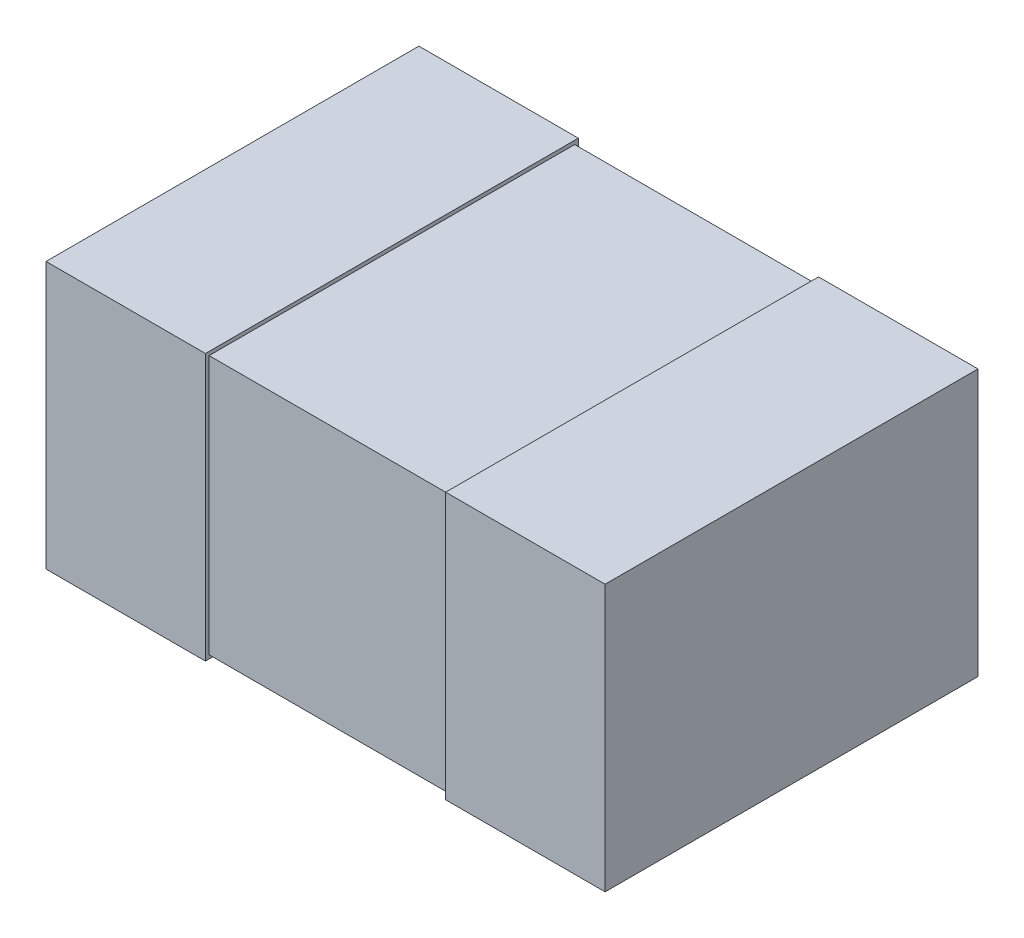
ISO-10303-21;
HEADER;
FILE_DESCRIPTION(('STEP AP214'),'2;1');
FILE_NAME('part.step','',(''),(''),'','','');
FILE_SCHEMA(('AUTOMOTIVE_DESIGN { 1 0 10303 214 1 1 1 1 }'));
ENDSEC;
DATA;
#1=APPLICATION_CONTEXT('core data for automotive mechanical design processes');
#2=APPLICATION_PROTOCOL_DEFINITION('international standard','automotive_design',2000,#1);
#3=PRODUCT_CONTEXT('',#1,'mechanical');
#4=PRODUCT('Part','Part','',(#3));
#5=PRODUCT_RELATED_PRODUCT_CATEGORY('part','',(#4));
#6=PRODUCT_DEFINITION_FORMATION('','',#4);
#7=PRODUCT_DEFINITION_CONTEXT('part definition',#1,'design');
#8=PRODUCT_DEFINITION('design','',#6,#7);
#9=PRODUCT_DEFINITION_SHAPE('','',#8);
#10=(LENGTH_UNIT() NAMED_UNIT(*) SI_UNIT(.MILLI.,.METRE.));
#11=(NAMED_UNIT(*) PLANE_ANGLE_UNIT() SI_UNIT($,.RADIAN.));
#12=(NAMED_UNIT(*) SI_UNIT($,.STERADIAN.) SOLID_ANGLE_UNIT());
#13=UNCERTAINTY_MEASURE_WITH_UNIT(LENGTH_MEASURE(1.E-05),#10,'distance_accuracy_value','');
#14=(GEOMETRIC_REPRESENTATION_CONTEXT(3) GLOBAL_UNCERTAINTY_ASSIGNED_CONTEXT((#13)) GLOBAL_UNIT_ASSIGNED_CONTEXT((#10,
#11,#12)) REPRESENTATION_CONTEXT('',''));
#15=CARTESIAN_POINT('',(0.,0.,0.));
#16=DIRECTION('',(0.,0.,1.));
#17=DIRECTION('',(1.,0.,0.));
#18=AXIS2_PLACEMENT_3D('',#15,#16,#17);
#19=CARTESIAN_POINT('',(-0.229,0.247,0.007));
#20=DIRECTION('',(-1.,0.,0.));
#21=DIRECTION('',(0.,0.,1.));
#22=AXIS2_PLACEMENT_3D('',#19,#20,#21);
#23=PLANE('',#22);
#24=DIRECTION('',(0.,1.,0.));
#25=VECTOR('',#24,1.);
#26=CARTESIAN_POINT('',(-0.229,-0.247,0.704));
#27=LINE('',#26,#25);
#28=CARTESIAN_POINT('',(-0.229,0.247,0.704));
#29=VERTEX_POINT('',#28);
#30=CARTESIAN_POINT('',(-0.229,-0.247,0.704));
#31=VERTEX_POINT('',#30);
#32=EDGE_CURVE('P0_E68',#29,#31,#27,.F.);
#33=ORIENTED_EDGE('',*,*,#32,.F.);
#34=DIRECTION('',(0.,0.,1.));
#35=VECTOR('',#34,1.);
#36=CARTESIAN_POINT('',(-0.229,0.247,0.007));
#37=LINE('',#36,#35);
#38=CARTESIAN_POINT('',(-0.229,0.247,0.007));
#39=VERTEX_POINT('',#38);
#40=EDGE_CURVE('P0_E55',#39,#29,#37,.T.);
#41=ORIENTED_EDGE('',*,*,#40,.F.);
#42=DIRECTION('',(0.,1.,0.));
#43=VECTOR('',#42,1.);
#44=CARTESIAN_POINT('',(-0.229,0.247,0.007));
#45=LINE('',#44,#43);
#46=CARTESIAN_POINT('',(-0.229,-0.247,0.007));
#47=VERTEX_POINT('',#46);
#48=EDGE_CURVE('P0_E20',#47,#39,#45,.T.);
#49=ORIENTED_EDGE('',*,*,#48,.F.);
#50=DIRECTION('',(0.,0.,-1.));
#51=VECTOR('',#50,1.);
#52=CARTESIAN_POINT('',(-0.229,-0.247,0.007));
#53=LINE('',#52,#51);
#54=EDGE_CURVE('P0_E81',#31,#47,#53,.T.);
#55=ORIENTED_EDGE('',*,*,#54,.F.);
#56=EDGE_LOOP('',(#33,#41,#49,#55));
#57=FACE_BOUND('',#56,.T.);
#58=ADVANCED_FACE('P0_F17',(#57),#23,.T.);
#59=CARTESIAN_POINT('',(-0.229,0.247,0.007));
#60=DIRECTION('',(0.,0.,-1.));
#61=DIRECTION('',(-1.,0.,0.));
#62=AXIS2_PLACEMENT_3D('',#59,#60,#61);
#63=PLANE('',#62);
#64=DIRECTION('',(1.,0.,0.));
#65=VECTOR('',#64,1.);
#66=CARTESIAN_POINT('',(-0.229,-0.247,0.007));
#67=LINE('',#66,#65);
#68=CARTESIAN_POINT('',(0.229,-0.247,0.007));
#69=VERTEX_POINT('',#68);
#70=EDGE_CURVE('P0_E64',#47,#69,#67,.T.);
#71=ORIENTED_EDGE('',*,*,#70,.F.);
#72=ORIENTED_EDGE('',*,*,#48,.T.);
#73=DIRECTION('',(1.,0.,0.));
#74=VECTOR('',#73,1.);
#75=CARTESIAN_POINT('',(0.229,0.247,0.007));
#76=LINE('',#75,#74);
#77=CARTESIAN_POINT('',(0.229,0.247,0.007));
#78=VERTEX_POINT('',#77);
#79=EDGE_CURVE('P0_E61',#78,#39,#76,.F.);
#80=ORIENTED_EDGE('',*,*,#79,.F.);
#81=DIRECTION('',(0.,1.,0.));
#82=VECTOR('',#81,1.);
#83=CARTESIAN_POINT('',(0.229,-0.247,0.007));
#84=LINE('',#83,#82);
#85=EDGE_CURVE('P0_E83',#69,#78,#84,.T.);
#86=ORIENTED_EDGE('',*,*,#85,.F.);
#87=EDGE_LOOP('',(#71,#72,#80,#86));
#88=FACE_BOUND('',#87,.T.);
#89=ADVANCED_FACE('P0_F60',(#88),#63,.T.);
#90=CARTESIAN_POINT('',(0.229,0.247,0.007));
#91=DIRECTION('',(0.,1.,0.));
#92=DIRECTION('',(0.,0.,1.));
#93=AXIS2_PLACEMENT_3D('',#90,#91,#92);
#94=PLANE('',#93);
#95=DIRECTION('',(1.,0.,0.));
#96=VECTOR('',#95,1.);
#97=CARTESIAN_POINT('',(-0.229,0.247,0.704));
#98=LINE('',#97,#96);
#99=CARTESIAN_POINT('',(0.229,0.247,0.704));
#100=VERTEX_POINT('',#99);
#101=EDGE_CURVE('P0_E70',#100,#29,#98,.F.);
#102=ORIENTED_EDGE('',*,*,#101,.F.);
#103=DIRECTION('',(0.,0.,-1.));
#104=VECTOR('',#103,1.);
#105=CARTESIAN_POINT('',(0.229,0.247,0.007));
#106=LINE('',#105,#104);
#107=EDGE_CURVE('P0_E74',#78,#100,#106,.F.);
#108=ORIENTED_EDGE('',*,*,#107,.F.);
#109=ORIENTED_EDGE('',*,*,#79,.T.);
#110=ORIENTED_EDGE('',*,*,#40,.T.);
#111=EDGE_LOOP('',(#102,#108,#109,#110));
#112=FACE_BOUND('',#111,.T.);
#113=ADVANCED_FACE('P0_F72',(#112),#94,.T.);
#114=CARTESIAN_POINT('',(-0.229,-0.247,0.704));
#115=DIRECTION('',(0.,0.,1.));
#116=DIRECTION('',(1.,0.,0.));
#117=AXIS2_PLACEMENT_3D('',#114,#115,#116);
#118=PLANE('',#117);
#119=ORIENTED_EDGE('',*,*,#101,.T.);
#120=ORIENTED_EDGE('',*,*,#32,.T.);
#121=DIRECTION('',(1.,0.,0.));
#122=VECTOR('',#121,1.);
#123=CARTESIAN_POINT('',(-0.229,-0.247,0.704));
#124=LINE('',#123,#122);
#125=CARTESIAN_POINT('',(0.229,-0.247,0.704));
#126=VERTEX_POINT('',#125);
#127=EDGE_CURVE('P0_E35',#126,#31,#124,.F.);
#128=ORIENTED_EDGE('',*,*,#127,.F.);
#129=DIRECTION('',(0.,1.,0.));
#130=VECTOR('',#129,1.);
#131=CARTESIAN_POINT('',(0.229,-0.247,0.704));
#132=LINE('',#131,#130);
#133=EDGE_CURVE('P0_E26',#100,#126,#132,.F.);
#134=ORIENTED_EDGE('',*,*,#133,.F.);
#135=EDGE_LOOP('',(#119,#120,#128,#134));
#136=FACE_BOUND('',#135,.T.);
#137=ADVANCED_FACE('P0_F89',(#136),#118,.T.);
#138=CARTESIAN_POINT('',(-0.229,-0.247,0.007));
#139=DIRECTION('',(0.,-1.,0.));
#140=DIRECTION('',(0.,0.,-1.));
#141=AXIS2_PLACEMENT_3D('',#138,#139,#140);
#142=PLANE('',#141);
#143=ORIENTED_EDGE('',*,*,#127,.T.);
#144=ORIENTED_EDGE('',*,*,#54,.T.);
#145=ORIENTED_EDGE('',*,*,#70,.T.);
#146=DIRECTION('',(0.,0.,-1.));
#147=VECTOR('',#146,1.);
#148=CARTESIAN_POINT('',(0.229,-0.247,0.007));
#149=LINE('',#148,#147);
#150=EDGE_CURVE('P0_E11',#126,#69,#149,.T.);
#151=ORIENTED_EDGE('',*,*,#150,.F.);
#152=EDGE_LOOP('',(#143,#144,#145,#151));
#153=FACE_BOUND('',#152,.T.);
#154=ADVANCED_FACE('P0_F91',(#153),#142,.T.);
#155=CARTESIAN_POINT('',(0.229,-0.247,0.007));
#156=DIRECTION('',(1.,0.,0.));
#157=DIRECTION('',(0.,0.,-1.));
#158=AXIS2_PLACEMENT_3D('',#155,#156,#157);
#159=PLANE('',#158);
#160=ORIENTED_EDGE('',*,*,#133,.T.);
#161=ORIENTED_EDGE('',*,*,#150,.T.);
#162=ORIENTED_EDGE('',*,*,#85,.T.);
#163=ORIENTED_EDGE('',*,*,#107,.T.);
#164=EDGE_LOOP('',(#160,#161,#162,#163));
#165=FACE_BOUND('',#164,.T.);
#166=ADVANCED_FACE('P0_F88',(#165),#159,.T.);
#167=CLOSED_SHELL('',(#58,#89,#113,#137,#154,#166));
#168=MANIFOLD_SOLID_BREP('P0_B1',#167);
#169=CARTESIAN_POINT('',(0.229,0.254,0.));
#170=DIRECTION('',(-1.,0.,0.));
#171=DIRECTION('',(0.,0.,1.));
#172=AXIS2_PLACEMENT_3D('',#169,#170,#171);
#173=PLANE('',#172);
#174=DIRECTION('',(0.,1.,0.));
#175=VECTOR('',#174,1.);
#176=CARTESIAN_POINT('',(0.229,-0.254,0.711));
#177=LINE('',#176,#175);
#178=CARTESIAN_POINT('',(0.229,0.254,0.711));
#179=VERTEX_POINT('',#178);
#180=CARTESIAN_POINT('',(0.229,-0.254,0.711));
#181=VERTEX_POINT('',#180);
#182=EDGE_CURVE('P1_E68',#179,#181,#177,.F.);
#183=ORIENTED_EDGE('',*,*,#182,.F.);
#184=DIRECTION('',(0.,0.,1.));
#185=VECTOR('',#184,1.);
#186=CARTESIAN_POINT('',(0.229,0.254,0.));
#187=LINE('',#186,#185);
#188=CARTESIAN_POINT('',(0.229,0.254,0.));
#189=VERTEX_POINT('',#188);
#190=EDGE_CURVE('P1_E55',#189,#179,#187,.T.);
#191=ORIENTED_EDGE('',*,*,#190,.F.);
#192=DIRECTION('',(0.,1.,0.));
#193=VECTOR('',#192,1.);
#194=CARTESIAN_POINT('',(0.229,0.254,0.));
#195=LINE('',#194,#193);
#196=CARTESIAN_POINT('',(0.229,-0.254,0.));
#197=VERTEX_POINT('',#196);
#198=EDGE_CURVE('P1_E20',#197,#189,#195,.T.);
#199=ORIENTED_EDGE('',*,*,#198,.F.);
#200=DIRECTION('',(0.,0.,-1.));
#201=VECTOR('',#200,1.);
#202=CARTESIAN_POINT('',(0.229,-0.254,0.));
#203=LINE('',#202,#201);
#204=EDGE_CURVE('P1_E81',#181,#197,#203,.T.);
#205=ORIENTED_EDGE('',*,*,#204,.F.);
#206=EDGE_LOOP('',(#183,#191,#199,#205));
#207=FACE_BOUND('',#206,.T.);
#208=ADVANCED_FACE('P1_F17',(#207),#173,.T.);
#209=CARTESIAN_POINT('',(0.229,0.254,0.));
#210=DIRECTION('',(0.,0.,-1.));
#211=DIRECTION('',(-1.,0.,0.));
#212=AXIS2_PLACEMENT_3D('',#209,#210,#211);
#213=PLANE('',#212);
#214=DIRECTION('',(1.,0.,0.));
#215=VECTOR('',#214,1.);
#216=CARTESIAN_POINT('',(0.229,-0.254,0.));
#217=LINE('',#216,#215);
#218=CARTESIAN_POINT('',(0.533,-0.254,0.));
#219=VERTEX_POINT('',#218);
#220=EDGE_CURVE('P1_E64',#197,#219,#217,.T.);
#221=ORIENTED_EDGE('',*,*,#220,.F.);
#222=ORIENTED_EDGE('',*,*,#198,.T.);
#223=DIRECTION('',(1.,0.,0.));
#224=VECTOR('',#223,1.);
#225=CARTESIAN_POINT('',(0.533,0.254,0.));
#226=LINE('',#225,#224);
#227=CARTESIAN_POINT('',(0.533,0.254,0.));
#228=VERTEX_POINT('',#227);
#229=EDGE_CURVE('P1_E61',#228,#189,#226,.F.);
#230=ORIENTED_EDGE('',*,*,#229,.F.);
#231=DIRECTION('',(0.,1.,0.));
#232=VECTOR('',#231,1.);
#233=CARTESIAN_POINT('',(0.533,-0.254,0.));
#234=LINE('',#233,#232);
#235=EDGE_CURVE('P1_E83',#219,#228,#234,.T.);
#236=ORIENTED_EDGE('',*,*,#235,.F.);
#237=EDGE_LOOP('',(#221,#222,#230,#236));
#238=FACE_BOUND('',#237,.T.);
#239=ADVANCED_FACE('P1_F60',(#238),#213,.T.);
#240=CARTESIAN_POINT('',(0.533,0.254,0.));
#241=DIRECTION('',(0.,1.,0.));
#242=DIRECTION('',(0.,0.,1.));
#243=AXIS2_PLACEMENT_3D('',#240,#241,#242);
#244=PLANE('',#243);
#245=DIRECTION('',(1.,0.,0.));
#246=VECTOR('',#245,1.);
#247=CARTESIAN_POINT('',(0.229,0.254,0.711));
#248=LINE('',#247,#246);
#249=CARTESIAN_POINT('',(0.533,0.254,0.711));
#250=VERTEX_POINT('',#249);
#251=EDGE_CURVE('P1_E70',#250,#179,#248,.F.);
#252=ORIENTED_EDGE('',*,*,#251,.F.);
#253=DIRECTION('',(0.,0.,-1.));
#254=VECTOR('',#253,1.);
#255=CARTESIAN_POINT('',(0.533,0.254,0.));
#256=LINE('',#255,#254);
#257=EDGE_CURVE('P1_E74',#228,#250,#256,.F.);
#258=ORIENTED_EDGE('',*,*,#257,.F.);
#259=ORIENTED_EDGE('',*,*,#229,.T.);
#260=ORIENTED_EDGE('',*,*,#190,.T.);
#261=EDGE_LOOP('',(#252,#258,#259,#260));
#262=FACE_BOUND('',#261,.T.);
#263=ADVANCED_FACE('P1_F72',(#262),#244,.T.);
#264=CARTESIAN_POINT('',(0.229,-0.254,0.711));
#265=DIRECTION('',(0.,0.,1.));
#266=DIRECTION('',(1.,0.,0.));
#267=AXIS2_PLACEMENT_3D('',#264,#265,#266);
#268=PLANE('',#267);
#269=ORIENTED_EDGE('',*,*,#251,.T.);
#270=ORIENTED_EDGE('',*,*,#182,.T.);
#271=DIRECTION('',(1.,0.,0.));
#272=VECTOR('',#271,1.);
#273=CARTESIAN_POINT('',(0.229,-0.254,0.711));
#274=LINE('',#273,#272);
#275=CARTESIAN_POINT('',(0.533,-0.254,0.711));
#276=VERTEX_POINT('',#275);
#277=EDGE_CURVE('P1_E35',#276,#181,#274,.F.);
#278=ORIENTED_EDGE('',*,*,#277,.F.);
#279=DIRECTION('',(0.,1.,0.));
#280=VECTOR('',#279,1.);
#281=CARTESIAN_POINT('',(0.533,-0.254,0.711));
#282=LINE('',#281,#280);
#283=EDGE_CURVE('P1_E26',#250,#276,#282,.F.);
#284=ORIENTED_EDGE('',*,*,#283,.F.);
#285=EDGE_LOOP('',(#269,#270,#278,#284));
#286=FACE_BOUND('',#285,.T.);
#287=ADVANCED_FACE('P1_F89',(#286),#268,.T.);
#288=CARTESIAN_POINT('',(0.229,-0.254,0.));
#289=DIRECTION('',(0.,-1.,0.));
#290=DIRECTION('',(0.,0.,-1.));
#291=AXIS2_PLACEMENT_3D('',#288,#289,#290);
#292=PLANE('',#291);
#293=ORIENTED_EDGE('',*,*,#277,.T.);
#294=ORIENTED_EDGE('',*,*,#204,.T.);
#295=ORIENTED_EDGE('',*,*,#220,.T.);
#296=DIRECTION('',(0.,0.,-1.));
#297=VECTOR('',#296,1.);
#298=CARTESIAN_POINT('',(0.533,-0.254,0.));
#299=LINE('',#298,#297);
#300=EDGE_CURVE('P1_E11',#276,#219,#299,.T.);
#301=ORIENTED_EDGE('',*,*,#300,.F.);
#302=EDGE_LOOP('',(#293,#294,#295,#301));
#303=FACE_BOUND('',#302,.T.);
#304=ADVANCED_FACE('P1_F91',(#303),#292,.T.);
#305=CARTESIAN_POINT('',(0.533,-0.254,0.));
#306=DIRECTION('',(1.,0.,0.));
#307=DIRECTION('',(0.,0.,-1.));
#308=AXIS2_PLACEMENT_3D('',#305,#306,#307);
#309=PLANE('',#308);
#310=ORIENTED_EDGE('',*,*,#283,.T.);
#311=ORIENTED_EDGE('',*,*,#300,.T.);
#312=ORIENTED_EDGE('',*,*,#235,.T.);
#313=ORIENTED_EDGE('',*,*,#257,.T.);
#314=EDGE_LOOP('',(#310,#311,#312,#313));
#315=FACE_BOUND('',#314,.T.);
#316=ADVANCED_FACE('P1_F88',(#315),#309,.T.);
#317=CLOSED_SHELL('',(#208,#239,#263,#287,#304,#316));
#318=MANIFOLD_SOLID_BREP('P1_B1',#317);
#319=CARTESIAN_POINT('',(-0.533,0.254,0.));
#320=DIRECTION('',(-1.,0.,0.));
#321=DIRECTION('',(0.,0.,1.));
#322=AXIS2_PLACEMENT_3D('',#319,#320,#321);
#323=PLANE('',#322);
#324=DIRECTION('',(0.,1.,0.));
#325=VECTOR('',#324,1.);
#326=CARTESIAN_POINT('',(-0.533,-0.254,0.711));
#327=LINE('',#326,#325);
#328=CARTESIAN_POINT('',(-0.533,0.254,0.711));
#329=VERTEX_POINT('',#328);
#330=CARTESIAN_POINT('',(-0.533,-0.254,0.711));
#331=VERTEX_POINT('',#330);
#332=EDGE_CURVE('P2_E68',#329,#331,#327,.F.);
#333=ORIENTED_EDGE('',*,*,#332,.F.);
#334=DIRECTION('',(0.,0.,1.));
#335=VECTOR('',#334,1.);
#336=CARTESIAN_POINT('',(-0.533,0.254,0.));
#337=LINE('',#336,#335);
#338=CARTESIAN_POINT('',(-0.533,0.254,0.));
#339=VERTEX_POINT('',#338);
#340=EDGE_CURVE('P2_E55',#339,#329,#337,.T.);
#341=ORIENTED_EDGE('',*,*,#340,.F.);
#342=DIRECTION('',(0.,1.,0.));
#343=VECTOR('',#342,1.);
#344=CARTESIAN_POINT('',(-0.533,0.254,0.));
#345=LINE('',#344,#343);
#346=CARTESIAN_POINT('',(-0.533,-0.254,0.));
#347=VERTEX_POINT('',#346);
#348=EDGE_CURVE('P2_E20',#347,#339,#345,.T.);
#349=ORIENTED_EDGE('',*,*,#348,.F.);
#350=DIRECTION('',(0.,0.,-1.));
#351=VECTOR('',#350,1.);
#352=CARTESIAN_POINT('',(-0.533,-0.254,0.));
#353=LINE('',#352,#351);
#354=EDGE_CURVE('P2_E81',#331,#347,#353,.T.);
#355=ORIENTED_EDGE('',*,*,#354,.F.);
#356=EDGE_LOOP('',(#333,#341,#349,#355));
#357=FACE_BOUND('',#356,.T.);
#358=ADVANCED_FACE('P2_F17',(#357),#323,.T.);
#359=CARTESIAN_POINT('',(-0.533,0.254,0.));
#360=DIRECTION('',(0.,0.,-1.));
#361=DIRECTION('',(-1.,0.,0.));
#362=AXIS2_PLACEMENT_3D('',#359,#360,#361);
#363=PLANE('',#362);
#364=DIRECTION('',(1.,0.,0.));
#365=VECTOR('',#364,1.);
#366=CARTESIAN_POINT('',(-0.533,-0.254,0.));
#367=LINE('',#366,#365);
#368=CARTESIAN_POINT('',(-0.229,-0.254,0.));
#369=VERTEX_POINT('',#368);
#370=EDGE_CURVE('P2_E64',#347,#369,#367,.T.);
#371=ORIENTED_EDGE('',*,*,#370,.F.);
#372=ORIENTED_EDGE('',*,*,#348,.T.);
#373=DIRECTION('',(1.,0.,0.));
#374=VECTOR('',#373,1.);
#375=CARTESIAN_POINT('',(-0.229,0.254,0.));
#376=LINE('',#375,#374);
#377=CARTESIAN_POINT('',(-0.229,0.254,0.));
#378=VERTEX_POINT('',#377);
#379=EDGE_CURVE('P2_E61',#378,#339,#376,.F.);
#380=ORIENTED_EDGE('',*,*,#379,.F.);
#381=DIRECTION('',(0.,1.,0.));
#382=VECTOR('',#381,1.);
#383=CARTESIAN_POINT('',(-0.229,-0.254,0.));
#384=LINE('',#383,#382);
#385=EDGE_CURVE('P2_E83',#369,#378,#384,.T.);
#386=ORIENTED_EDGE('',*,*,#385,.F.);
#387=EDGE_LOOP('',(#371,#372,#380,#386));
#388=FACE_BOUND('',#387,.T.);
#389=ADVANCED_FACE('P2_F60',(#388),#363,.T.);
#390=CARTESIAN_POINT('',(-0.229,0.254,0.));
#391=DIRECTION('',(0.,1.,0.));
#392=DIRECTION('',(0.,0.,1.));
#393=AXIS2_PLACEMENT_3D('',#390,#391,#392);
#394=PLANE('',#393);
#395=DIRECTION('',(1.,0.,0.));
#396=VECTOR('',#395,1.);
#397=CARTESIAN_POINT('',(-0.533,0.254,0.711));
#398=LINE('',#397,#396);
#399=CARTESIAN_POINT('',(-0.229,0.254,0.711));
#400=VERTEX_POINT('',#399);
#401=EDGE_CURVE('P2_E70',#400,#329,#398,.F.);
#402=ORIENTED_EDGE('',*,*,#401,.F.);
#403=DIRECTION('',(0.,0.,-1.));
#404=VECTOR('',#403,1.);
#405=CARTESIAN_POINT('',(-0.229,0.254,0.));
#406=LINE('',#405,#404);
#407=EDGE_CURVE('P2_E74',#378,#400,#406,.F.);
#408=ORIENTED_EDGE('',*,*,#407,.F.);
#409=ORIENTED_EDGE('',*,*,#379,.T.);
#410=ORIENTED_EDGE('',*,*,#340,.T.);
#411=EDGE_LOOP('',(#402,#408,#409,#410));
#412=FACE_BOUND('',#411,.T.);
#413=ADVANCED_FACE('P2_F72',(#412),#394,.T.);
#414=CARTESIAN_POINT('',(-0.533,-0.254,0.711));
#415=DIRECTION('',(0.,0.,1.));
#416=DIRECTION('',(1.,0.,0.));
#417=AXIS2_PLACEMENT_3D('',#414,#415,#416);
#418=PLANE('',#417);
#419=ORIENTED_EDGE('',*,*,#401,.T.);
#420=ORIENTED_EDGE('',*,*,#332,.T.);
#421=DIRECTION('',(1.,0.,0.));
#422=VECTOR('',#421,1.);
#423=CARTESIAN_POINT('',(-0.533,-0.254,0.711));
#424=LINE('',#423,#422);
#425=CARTESIAN_POINT('',(-0.229,-0.254,0.711));
#426=VERTEX_POINT('',#425);
#427=EDGE_CURVE('P2_E35',#426,#331,#424,.F.);
#428=ORIENTED_EDGE('',*,*,#427,.F.);
#429=DIRECTION('',(0.,1.,0.));
#430=VECTOR('',#429,1.);
#431=CARTESIAN_POINT('',(-0.229,-0.254,0.711));
#432=LINE('',#431,#430);
#433=EDGE_CURVE('P2_E26',#400,#426,#432,.F.);
#434=ORIENTED_EDGE('',*,*,#433,.F.);
#435=EDGE_LOOP('',(#419,#420,#428,#434));
#436=FACE_BOUND('',#435,.T.);
#437=ADVANCED_FACE('P2_F89',(#436),#418,.T.);
#438=CARTESIAN_POINT('',(-0.533,-0.254,0.));
#439=DIRECTION('',(0.,-1.,0.));
#440=DIRECTION('',(0.,0.,-1.));
#441=AXIS2_PLACEMENT_3D('',#438,#439,#440);
#442=PLANE('',#441);
#443=ORIENTED_EDGE('',*,*,#427,.T.);
#444=ORIENTED_EDGE('',*,*,#354,.T.);
#445=ORIENTED_EDGE('',*,*,#370,.T.);
#446=DIRECTION('',(0.,0.,-1.));
#447=VECTOR('',#446,1.);
#448=CARTESIAN_POINT('',(-0.229,-0.254,0.));
#449=LINE('',#448,#447);
#450=EDGE_CURVE('P2_E11',#426,#369,#449,.T.);
#451=ORIENTED_EDGE('',*,*,#450,.F.);
#452=EDGE_LOOP('',(#443,#444,#445,#451));
#453=FACE_BOUND('',#452,.T.);
#454=ADVANCED_FACE('P2_F91',(#453),#442,.T.);
#455=CARTESIAN_POINT('',(-0.229,-0.254,0.));
#456=DIRECTION('',(1.,0.,0.));
#457=DIRECTION('',(0.,0.,-1.));
#458=AXIS2_PLACEMENT_3D('',#455,#456,#457);
#459=PLANE('',#458);
#460=ORIENTED_EDGE('',*,*,#433,.T.);
#461=ORIENTED_EDGE('',*,*,#450,.T.);
#462=ORIENTED_EDGE('',*,*,#385,.T.);
#463=ORIENTED_EDGE('',*,*,#407,.T.);
#464=EDGE_LOOP('',(#460,#461,#462,#463));
#465=FACE_BOUND('',#464,.T.);
#466=ADVANCED_FACE('P2_F88',(#465),#459,.T.);
#467=CLOSED_SHELL('',(#358,#389,#413,#437,#454,#466));
#468=MANIFOLD_SOLID_BREP('P2_B1',#467);
#469=ADVANCED_BREP_SHAPE_REPRESENTATION('',(#18,#168,#318,#468),#14);
#470=SHAPE_DEFINITION_REPRESENTATION(#9,#469);
ENDSEC;
END-ISO-10303-21;
